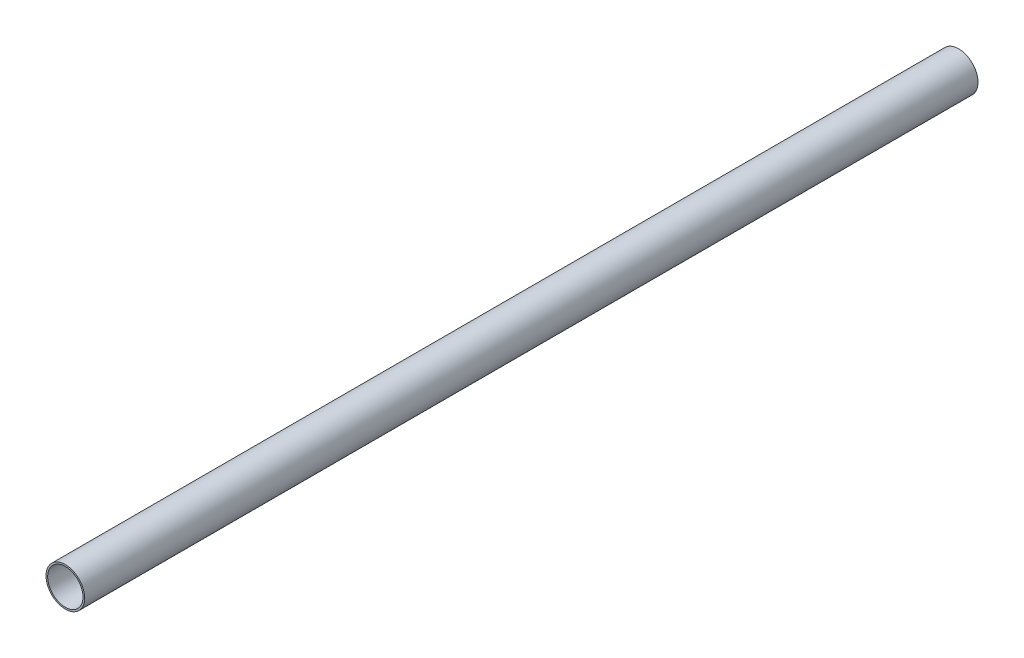
ISO-10303-21;
HEADER;
FILE_DESCRIPTION(('STEP AP214'),'2;1');
FILE_NAME('part.step','',(''),(''),'','','');
FILE_SCHEMA(('AUTOMOTIVE_DESIGN { 1 0 10303 214 1 1 1 1 }'));
ENDSEC;
DATA;
#1=APPLICATION_CONTEXT('core data for automotive mechanical design processes');
#2=APPLICATION_PROTOCOL_DEFINITION('international standard','automotive_design',2000,#1);
#3=PRODUCT_CONTEXT('',#1,'mechanical');
#4=PRODUCT('Part','Part','',(#3));
#5=PRODUCT_RELATED_PRODUCT_CATEGORY('part','',(#4));
#6=PRODUCT_DEFINITION_FORMATION('','',#4);
#7=PRODUCT_DEFINITION_CONTEXT('part definition',#1,'design');
#8=PRODUCT_DEFINITION('design','',#6,#7);
#9=PRODUCT_DEFINITION_SHAPE('','',#8);
#10=(LENGTH_UNIT() NAMED_UNIT(*) SI_UNIT(.MILLI.,.METRE.));
#11=(NAMED_UNIT(*) PLANE_ANGLE_UNIT() SI_UNIT($,.RADIAN.));
#12=(NAMED_UNIT(*) SI_UNIT($,.STERADIAN.) SOLID_ANGLE_UNIT());
#13=UNCERTAINTY_MEASURE_WITH_UNIT(LENGTH_MEASURE(1.E-05),#10,'distance_accuracy_value','');
#14=(GEOMETRIC_REPRESENTATION_CONTEXT(3) GLOBAL_UNCERTAINTY_ASSIGNED_CONTEXT((#13)) GLOBAL_UNIT_ASSIGNED_CONTEXT((#10,
#11,#12)) REPRESENTATION_CONTEXT('',''));
#15=CARTESIAN_POINT('',(0.,0.,0.));
#16=DIRECTION('',(0.,0.,1.));
#17=DIRECTION('',(1.,0.,0.));
#18=AXIS2_PLACEMENT_3D('',#15,#16,#17);
#19=CARTESIAN_POINT('',(0.,0.,0.));
#20=DIRECTION('',(0.,0.,-1.));
#21=DIRECTION('',(0.,-1.,0.));
#22=AXIS2_PLACEMENT_3D('',#19,#20,#21);
#23=CYLINDRICAL_SURFACE('',#22,17.399);
#24=CARTESIAN_POINT('',(0.,0.,-879.602));
#25=DIRECTION('',(0.,0.,1.));
#26=DIRECTION('',(1.,0.,0.));
#27=AXIS2_PLACEMENT_3D('',#24,#25,#26);
#28=CIRCLE('',#27,17.399);
#29=CARTESIAN_POINT('',(17.399,0.,-879.602));
#30=VERTEX_POINT('',#29);
#31=EDGE_CURVE('E25',#30,#30,#28,.T.);
#32=ORIENTED_EDGE('',*,*,#31,.F.);
#33=EDGE_LOOP('',(#32));
#34=FACE_BOUND('',#33,.T.);
#35=CARTESIAN_POINT('',(0.,0.,0.));
#36=DIRECTION('',(0.,0.,-1.));
#37=DIRECTION('',(0.,-1.,0.));
#38=AXIS2_PLACEMENT_3D('',#35,#36,#37);
#39=CIRCLE('',#38,17.399);
#40=CARTESIAN_POINT('',(0.,-17.399,0.));
#41=VERTEX_POINT('',#40);
#42=EDGE_CURVE('E29',#41,#41,#39,.T.);
#43=ORIENTED_EDGE('',*,*,#42,.F.);
#44=EDGE_LOOP('',(#43));
#45=FACE_BOUND('',#44,.T.);
#46=ADVANCED_FACE('F14',(#34,#45),#23,.F.);
#47=CARTESIAN_POINT('',(0.,0.,0.));
#48=DIRECTION('',(0.,0.,-1.));
#49=DIRECTION('',(0.,-1.,0.));
#50=AXIS2_PLACEMENT_3D('',#47,#48,#49);
#51=CYLINDRICAL_SURFACE('',#50,19.05);
#52=CARTESIAN_POINT('',(0.,0.,-879.602));
#53=DIRECTION('',(0.,0.,-1.));
#54=DIRECTION('',(0.,-1.,0.));
#55=AXIS2_PLACEMENT_3D('',#52,#53,#54);
#56=CIRCLE('',#55,19.05);
#57=CARTESIAN_POINT('',(0.,-19.05,-879.602));
#58=VERTEX_POINT('',#57);
#59=EDGE_CURVE('E21',#58,#58,#56,.T.);
#60=ORIENTED_EDGE('',*,*,#59,.F.);
#61=EDGE_LOOP('',(#60));
#62=FACE_BOUND('',#61,.T.);
#63=CARTESIAN_POINT('',(0.,0.,0.));
#64=DIRECTION('',(0.,0.,-1.));
#65=DIRECTION('',(0.,-1.,0.));
#66=AXIS2_PLACEMENT_3D('',#63,#64,#65);
#67=CIRCLE('',#66,19.05);
#68=CARTESIAN_POINT('',(0.,-19.05,0.));
#69=VERTEX_POINT('',#68);
#70=EDGE_CURVE('E9',#69,#69,#67,.T.);
#71=ORIENTED_EDGE('',*,*,#70,.T.);
#72=EDGE_LOOP('',(#71));
#73=FACE_BOUND('',#72,.T.);
#74=ADVANCED_FACE('F16',(#62,#73),#51,.T.);
#75=CARTESIAN_POINT('',(0.,0.,-879.602));
#76=DIRECTION('',(0.,0.,1.));
#77=DIRECTION('',(1.,0.,0.));
#78=AXIS2_PLACEMENT_3D('',#75,#76,#77);
#79=PLANE('',#78);
#80=ORIENTED_EDGE('',*,*,#59,.T.);
#81=EDGE_LOOP('',(#80));
#82=FACE_BOUND('',#81,.T.);
#83=ORIENTED_EDGE('',*,*,#31,.T.);
#84=EDGE_LOOP('',(#83));
#85=FACE_BOUND('',#84,.T.);
#86=ADVANCED_FACE('F43',(#82,#85),#79,.F.);
#87=CARTESIAN_POINT('',(0.,0.,0.));
#88=DIRECTION('',(0.,0.,1.));
#89=DIRECTION('',(1.,0.,0.));
#90=AXIS2_PLACEMENT_3D('',#87,#88,#89);
#91=PLANE('',#90);
#92=ORIENTED_EDGE('',*,*,#70,.F.);
#93=EDGE_LOOP('',(#92));
#94=FACE_BOUND('',#93,.T.);
#95=ORIENTED_EDGE('',*,*,#42,.T.);
#96=EDGE_LOOP('',(#95));
#97=FACE_BOUND('',#96,.T.);
#98=ADVANCED_FACE('F35',(#94,#97),#91,.T.);
#99=CLOSED_SHELL('',(#46,#74,#86,#98));
#100=MANIFOLD_SOLID_BREP('B1',#99);
#101=ADVANCED_BREP_SHAPE_REPRESENTATION('',(#18,#100),#14);
#102=SHAPE_DEFINITION_REPRESENTATION(#9,#101);
ENDSEC;
END-ISO-10303-21;
